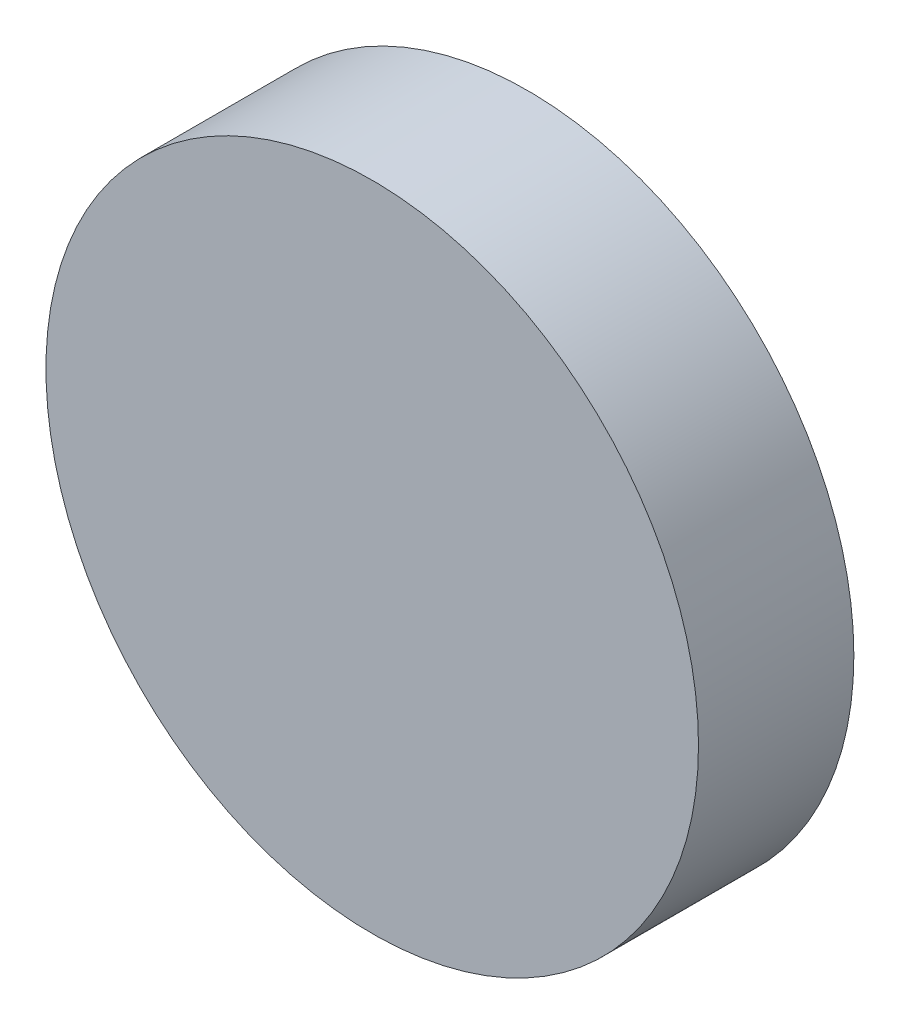
ISO-10303-21;
HEADER;
FILE_DESCRIPTION(('STEP AP214'),'2;1');
FILE_NAME('part.step','',(''),(''),'','','');
FILE_SCHEMA(('AUTOMOTIVE_DESIGN { 1 0 10303 214 1 1 1 1 }'));
ENDSEC;
DATA;
#1=APPLICATION_CONTEXT('core data for automotive mechanical design processes');
#2=APPLICATION_PROTOCOL_DEFINITION('international standard','automotive_design',2000,#1);
#3=PRODUCT_CONTEXT('',#1,'mechanical');
#4=PRODUCT('Part','Part','',(#3));
#5=PRODUCT_RELATED_PRODUCT_CATEGORY('part','',(#4));
#6=PRODUCT_DEFINITION_FORMATION('','',#4);
#7=PRODUCT_DEFINITION_CONTEXT('part definition',#1,'design');
#8=PRODUCT_DEFINITION('design','',#6,#7);
#9=PRODUCT_DEFINITION_SHAPE('','',#8);
#10=(LENGTH_UNIT() NAMED_UNIT(*) SI_UNIT(.MILLI.,.METRE.));
#11=(NAMED_UNIT(*) PLANE_ANGLE_UNIT() SI_UNIT($,.RADIAN.));
#12=(NAMED_UNIT(*) SI_UNIT($,.STERADIAN.) SOLID_ANGLE_UNIT());
#13=UNCERTAINTY_MEASURE_WITH_UNIT(LENGTH_MEASURE(1.E-05),#10,'distance_accuracy_value','');
#14=(GEOMETRIC_REPRESENTATION_CONTEXT(3) GLOBAL_UNCERTAINTY_ASSIGNED_CONTEXT((#13)) GLOBAL_UNIT_ASSIGNED_CONTEXT((#10,
#11,#12)) REPRESENTATION_CONTEXT('',''));
#15=CARTESIAN_POINT('',(0.,0.,0.));
#16=DIRECTION('',(0.,0.,1.));
#17=DIRECTION('',(1.,0.,0.));
#18=AXIS2_PLACEMENT_3D('',#15,#16,#17);
#19=CARTESIAN_POINT('',(0.,0.,50.));
#20=DIRECTION('',(0.,0.,-1.));
#21=DIRECTION('',(-1.,0.,0.));
#22=AXIS2_PLACEMENT_3D('',#19,#20,#21);
#23=CYLINDRICAL_SURFACE('',#22,105.);
#24=CARTESIAN_POINT('',(0.,0.,50.));
#25=DIRECTION('',(0.,0.,1.));
#26=DIRECTION('',(1.,0.,0.));
#27=AXIS2_PLACEMENT_3D('',#24,#25,#26);
#28=CIRCLE('',#27,105.);
#29=CARTESIAN_POINT('',(105.,0.,50.));
#30=VERTEX_POINT('',#29);
#31=EDGE_CURVE('E10',#30,#30,#28,.T.);
#32=ORIENTED_EDGE('',*,*,#31,.F.);
#33=EDGE_LOOP('',(#32));
#34=FACE_BOUND('',#33,.T.);
#35=CARTESIAN_POINT('',(0.,0.,0.));
#36=DIRECTION('',(0.,0.,1.));
#37=DIRECTION('',(1.,0.,0.));
#38=AXIS2_PLACEMENT_3D('',#35,#36,#37);
#39=CIRCLE('',#38,105.);
#40=CARTESIAN_POINT('',(105.,0.,0.));
#41=VERTEX_POINT('',#40);
#42=EDGE_CURVE('E42',#41,#41,#39,.T.);
#43=ORIENTED_EDGE('',*,*,#42,.T.);
#44=EDGE_LOOP('',(#43));
#45=FACE_BOUND('',#44,.T.);
#46=ADVANCED_FACE('F39',(#34,#45),#23,.T.);
#47=CARTESIAN_POINT('',(0.,0.,50.));
#48=DIRECTION('',(0.,0.,1.));
#49=DIRECTION('',(1.,0.,0.));
#50=AXIS2_PLACEMENT_3D('',#47,#48,#49);
#51=PLANE('',#50);
#52=ORIENTED_EDGE('',*,*,#31,.T.);
#53=EDGE_LOOP('',(#52));
#54=FACE_BOUND('',#53,.T.);
#55=ADVANCED_FACE('F56',(#54),#51,.T.);
#56=CARTESIAN_POINT('',(0.,0.,0.));
#57=DIRECTION('',(0.,0.,1.));
#58=DIRECTION('',(1.,0.,0.));
#59=AXIS2_PLACEMENT_3D('',#56,#57,#58);
#60=PLANE('',#59);
#61=ORIENTED_EDGE('',*,*,#42,.F.);
#62=EDGE_LOOP('',(#61));
#63=FACE_BOUND('',#62,.T.);
#64=ADVANCED_FACE('F54',(#63),#60,.F.);
#65=CLOSED_SHELL('',(#46,#55,#64));
#66=MANIFOLD_SOLID_BREP('B2',#65);
#67=ADVANCED_BREP_SHAPE_REPRESENTATION('',(#18,#66),#14);
#68=SHAPE_DEFINITION_REPRESENTATION(#9,#67);
ENDSEC;
END-ISO-10303-21;
